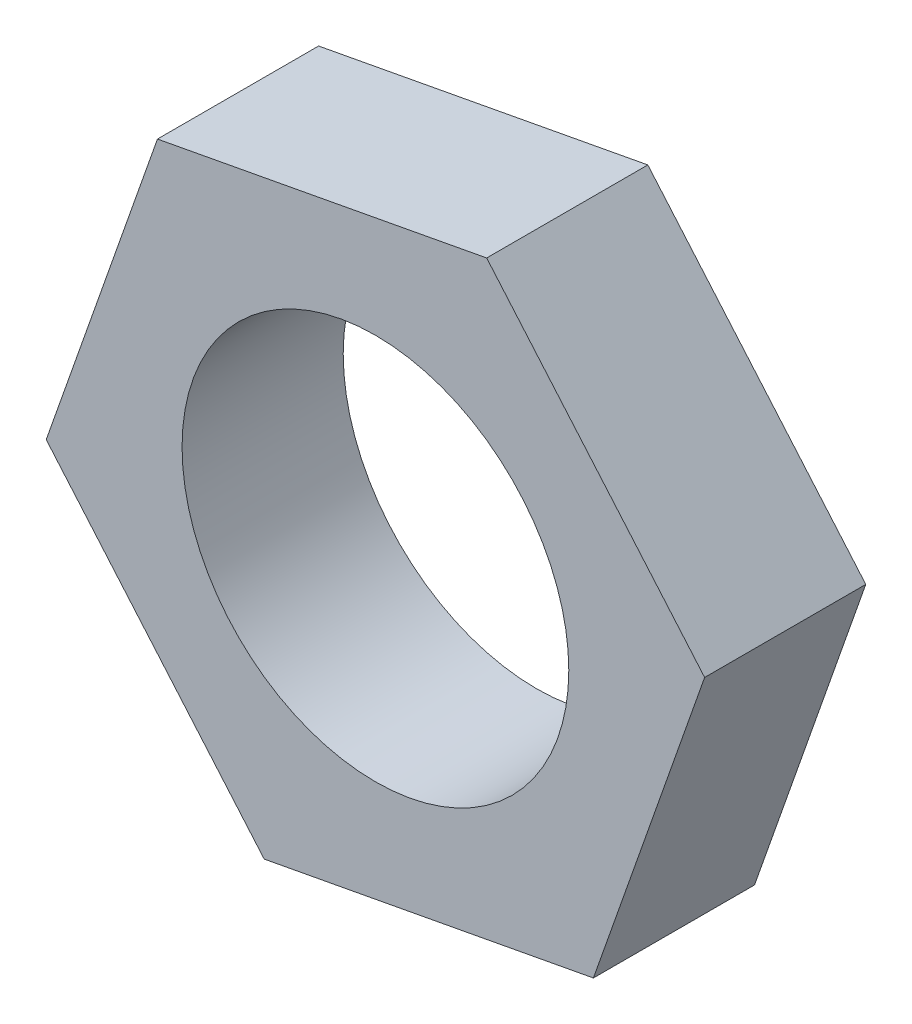
ISO-10303-21;
HEADER;
FILE_DESCRIPTION(('STEP AP214'),'2;1');
FILE_NAME('part.step','',(''),(''),'','','');
FILE_SCHEMA(('AUTOMOTIVE_DESIGN { 1 0 10303 214 1 1 1 1 }'));
ENDSEC;
DATA;
#1=APPLICATION_CONTEXT('core data for automotive mechanical design processes');
#2=APPLICATION_PROTOCOL_DEFINITION('international standard','automotive_design',2000,#1);
#3=PRODUCT_CONTEXT('',#1,'mechanical');
#4=PRODUCT('Part','Part','',(#3));
#5=PRODUCT_RELATED_PRODUCT_CATEGORY('part','',(#4));
#6=PRODUCT_DEFINITION_FORMATION('','',#4);
#7=PRODUCT_DEFINITION_CONTEXT('part definition',#1,'design');
#8=PRODUCT_DEFINITION('design','',#6,#7);
#9=PRODUCT_DEFINITION_SHAPE('','',#8);
#10=(LENGTH_UNIT() NAMED_UNIT(*) SI_UNIT(.MILLI.,.METRE.));
#11=(NAMED_UNIT(*) PLANE_ANGLE_UNIT() SI_UNIT($,.RADIAN.));
#12=(NAMED_UNIT(*) SI_UNIT($,.STERADIAN.) SOLID_ANGLE_UNIT());
#13=UNCERTAINTY_MEASURE_WITH_UNIT(LENGTH_MEASURE(1.E-05),#10,'distance_accuracy_value','');
#14=(GEOMETRIC_REPRESENTATION_CONTEXT(3) GLOBAL_UNCERTAINTY_ASSIGNED_CONTEXT((#13)) GLOBAL_UNIT_ASSIGNED_CONTEXT((#10,
#11,#12)) REPRESENTATION_CONTEXT('',''));
#15=CARTESIAN_POINT('',(0.,0.,0.));
#16=DIRECTION('',(0.,0.,1.));
#17=DIRECTION('',(1.,0.,0.));
#18=AXIS2_PLACEMENT_3D('',#15,#16,#17);
#19=CARTESIAN_POINT('',(0.,0.,2.5));
#20=DIRECTION('',(0.,0.,1.));
#21=DIRECTION('',(1.,0.,0.));
#22=AXIS2_PLACEMENT_3D('',#19,#20,#21);
#23=PLANE('',#22);
#24=DIRECTION('',(0.98293119236739,0.183973560793993,0.));
#25=VECTOR('',#24,1.);
#26=CARTESIAN_POINT('',(-3.45169824942779,-9.80233539494018,2.5));
#27=LINE('',#26,#25);
#28=CARTESIAN_POINT('',(-3.45169824942779,-9.80233539494018,2.5));
#29=VERTEX_POINT('',#28);
#30=CARTESIAN_POINT('',(6.76322234371967,-7.89042606767284,2.5));
#31=VERTEX_POINT('',#30);
#32=EDGE_CURVE('E146',#29,#31,#27,.T.);
#33=ORIENTED_EDGE('',*,*,#32,.T.);
#34=DIRECTION('',(0.332139818911416,0.943230163159285,0.));
#35=VECTOR('',#34,1.);
#36=CARTESIAN_POINT('',(6.76322234371967,-7.89042606767284,2.5));
#37=LINE('',#36,#35);
#38=CARTESIAN_POINT('',(10.2149205931475,1.91190932726735,2.5));
#39=VERTEX_POINT('',#38);
#40=EDGE_CURVE('E94',#31,#39,#37,.T.);
#41=ORIENTED_EDGE('',*,*,#40,.T.);
#42=DIRECTION('',(-0.650791373455974,0.759256602365292,0.));
#43=VECTOR('',#42,1.);
#44=CARTESIAN_POINT('',(10.2149205931475,1.91190932726735,2.5));
#45=LINE('',#44,#43);
#46=CARTESIAN_POINT('',(3.4516982494278,9.80233539494018,2.5));
#47=VERTEX_POINT('',#46);
#48=EDGE_CURVE('E107',#39,#47,#45,.T.);
#49=ORIENTED_EDGE('',*,*,#48,.T.);
#50=DIRECTION('',(-0.98293119236739,-0.183973560793993,0.));
#51=VECTOR('',#50,1.);
#52=CARTESIAN_POINT('',(3.4516982494278,9.80233539494018,2.5));
#53=LINE('',#52,#51);
#54=CARTESIAN_POINT('',(-6.76322234371966,7.89042606767284,2.5));
#55=VERTEX_POINT('',#54);
#56=EDGE_CURVE('E101',#47,#55,#53,.T.);
#57=ORIENTED_EDGE('',*,*,#56,.T.);
#58=DIRECTION('',(-0.332139818911417,-0.943230163159285,0.));
#59=VECTOR('',#58,1.);
#60=CARTESIAN_POINT('',(-6.76322234371966,7.89042606767284,2.5));
#61=LINE('',#60,#59);
#62=CARTESIAN_POINT('',(-10.2149205931475,-1.91190932726734,2.5));
#63=VERTEX_POINT('',#62);
#64=EDGE_CURVE('E105',#55,#63,#61,.T.);
#65=ORIENTED_EDGE('',*,*,#64,.T.);
#66=DIRECTION('',(0.650791373455974,-0.759256602365292,0.));
#67=VECTOR('',#66,1.);
#68=CARTESIAN_POINT('',(-10.2149205931475,-1.91190932726734,2.5));
#69=LINE('',#68,#67);
#70=EDGE_CURVE('E57',#63,#29,#69,.T.);
#71=ORIENTED_EDGE('',*,*,#70,.T.);
#72=EDGE_LOOP('',(#33,#41,#49,#57,#65,#71));
#73=FACE_BOUND('',#72,.T.);
#74=CARTESIAN_POINT('',(0.,0.,2.5));
#75=DIRECTION('',(0.,0.,1.));
#76=DIRECTION('',(1.,0.,0.));
#77=AXIS2_PLACEMENT_3D('',#74,#75,#76);
#78=CIRCLE('',#77,6.);
#79=CARTESIAN_POINT('',(6.,0.,2.5));
#80=VERTEX_POINT('',#79);
#81=EDGE_CURVE('E134',#80,#80,#78,.T.);
#82=ORIENTED_EDGE('',*,*,#81,.F.);
#83=EDGE_LOOP('',(#82));
#84=FACE_BOUND('',#83,.T.);
#85=ADVANCED_FACE('F39',(#73,#84),#23,.T.);
#86=CARTESIAN_POINT('',(0.,0.,-2.5));
#87=DIRECTION('',(0.,0.,1.));
#88=DIRECTION('',(1.,0.,0.));
#89=AXIS2_PLACEMENT_3D('',#86,#87,#88);
#90=PLANE('',#89);
#91=DIRECTION('',(0.98293119236739,0.183973560793993,0.));
#92=VECTOR('',#91,1.);
#93=CARTESIAN_POINT('',(-3.45169824942779,-9.80233539494018,-2.5));
#94=LINE('',#93,#92);
#95=CARTESIAN_POINT('',(-3.45169824942779,-9.80233539494018,-2.5));
#96=VERTEX_POINT('',#95);
#97=CARTESIAN_POINT('',(6.76322234371967,-7.89042606767284,-2.5));
#98=VERTEX_POINT('',#97);
#99=EDGE_CURVE('E129',#96,#98,#94,.T.);
#100=ORIENTED_EDGE('',*,*,#99,.F.);
#101=DIRECTION('',(0.650791373455974,-0.759256602365292,0.));
#102=VECTOR('',#101,1.);
#103=CARTESIAN_POINT('',(-10.2149205931475,-1.91190932726734,-2.5));
#104=LINE('',#103,#102);
#105=CARTESIAN_POINT('',(-10.2149205931475,-1.91190932726734,-2.5));
#106=VERTEX_POINT('',#105);
#107=EDGE_CURVE('E86',#106,#96,#104,.T.);
#108=ORIENTED_EDGE('',*,*,#107,.F.);
#109=DIRECTION('',(-0.332139818911417,-0.943230163159285,0.));
#110=VECTOR('',#109,1.);
#111=CARTESIAN_POINT('',(-6.76322234371966,7.89042606767284,-2.5));
#112=LINE('',#111,#110);
#113=CARTESIAN_POINT('',(-6.76322234371966,7.89042606767284,-2.5));
#114=VERTEX_POINT('',#113);
#115=EDGE_CURVE('E80',#114,#106,#112,.T.);
#116=ORIENTED_EDGE('',*,*,#115,.F.);
#117=DIRECTION('',(-0.98293119236739,-0.183973560793993,0.));
#118=VECTOR('',#117,1.);
#119=CARTESIAN_POINT('',(3.4516982494278,9.80233539494018,-2.5));
#120=LINE('',#119,#118);
#121=CARTESIAN_POINT('',(3.4516982494278,9.80233539494018,-2.5));
#122=VERTEX_POINT('',#121);
#123=EDGE_CURVE('E116',#122,#114,#120,.T.);
#124=ORIENTED_EDGE('',*,*,#123,.F.);
#125=DIRECTION('',(-0.650791373455974,0.759256602365292,0.));
#126=VECTOR('',#125,1.);
#127=CARTESIAN_POINT('',(10.2149205931475,1.91190932726735,-2.5));
#128=LINE('',#127,#126);
#129=CARTESIAN_POINT('',(10.2149205931475,1.91190932726735,-2.5));
#130=VERTEX_POINT('',#129);
#131=EDGE_CURVE('E137',#130,#122,#128,.T.);
#132=ORIENTED_EDGE('',*,*,#131,.F.);
#133=DIRECTION('',(0.332139818911416,0.943230163159285,0.));
#134=VECTOR('',#133,1.);
#135=CARTESIAN_POINT('',(6.76322234371967,-7.89042606767284,-2.5));
#136=LINE('',#135,#134);
#137=EDGE_CURVE('E133',#98,#130,#136,.T.);
#138=ORIENTED_EDGE('',*,*,#137,.F.);
#139=EDGE_LOOP('',(#100,#108,#116,#124,#132,#138));
#140=FACE_BOUND('',#139,.T.);
#141=CARTESIAN_POINT('',(0.,0.,-2.5));
#142=DIRECTION('',(0.,0.,1.));
#143=DIRECTION('',(1.,0.,0.));
#144=AXIS2_PLACEMENT_3D('',#141,#142,#143);
#145=CIRCLE('',#144,6.);
#146=CARTESIAN_POINT('',(6.,0.,-2.5));
#147=VERTEX_POINT('',#146);
#148=EDGE_CURVE('E243',#147,#147,#145,.T.);
#149=ORIENTED_EDGE('',*,*,#148,.T.);
#150=EDGE_LOOP('',(#149));
#151=FACE_BOUND('',#150,.T.);
#152=ADVANCED_FACE('F159',(#140,#151),#90,.F.);
#153=CARTESIAN_POINT('',(-3.45169824942779,-9.80233539494018,2.5));
#154=DIRECTION('',(-0.183973560793993,0.98293119236739,0.));
#155=DIRECTION('',(-0.98293119236739,-0.183973560793993,0.));
#156=AXIS2_PLACEMENT_3D('',#153,#154,#155);
#157=PLANE('',#156);
#158=ORIENTED_EDGE('',*,*,#99,.T.);
#159=DIRECTION('',(0.,0.,-1.));
#160=VECTOR('',#159,1.);
#161=CARTESIAN_POINT('',(6.76322234371967,-7.89042606767284,2.5));
#162=LINE('',#161,#160);
#163=EDGE_CURVE('E11',#31,#98,#162,.T.);
#164=ORIENTED_EDGE('',*,*,#163,.F.);
#165=ORIENTED_EDGE('',*,*,#32,.F.);
#166=DIRECTION('',(0.,0.,-1.));
#167=VECTOR('',#166,1.);
#168=CARTESIAN_POINT('',(-3.45169824942779,-9.80233539494018,2.5));
#169=LINE('',#168,#167);
#170=EDGE_CURVE('E125',#29,#96,#169,.T.);
#171=ORIENTED_EDGE('',*,*,#170,.T.);
#172=EDGE_LOOP('',(#158,#164,#165,#171));
#173=FACE_BOUND('',#172,.T.);
#174=ADVANCED_FACE('F41',(#173),#157,.F.);
#175=CARTESIAN_POINT('',(6.76322234371967,-7.89042606767284,2.5));
#176=DIRECTION('',(-0.943230163159285,0.332139818911416,0.));
#177=DIRECTION('',(-0.332139818911416,-0.943230163159285,0.));
#178=AXIS2_PLACEMENT_3D('',#175,#176,#177);
#179=PLANE('',#178);
#180=ORIENTED_EDGE('',*,*,#137,.T.);
#181=DIRECTION('',(0.,0.,-1.));
#182=VECTOR('',#181,1.);
#183=CARTESIAN_POINT('',(10.2149205931475,1.91190932726735,2.5));
#184=LINE('',#183,#182);
#185=EDGE_CURVE('E49',#39,#130,#184,.T.);
#186=ORIENTED_EDGE('',*,*,#185,.F.);
#187=ORIENTED_EDGE('',*,*,#40,.F.);
#188=ORIENTED_EDGE('',*,*,#163,.T.);
#189=EDGE_LOOP('',(#180,#186,#187,#188));
#190=FACE_BOUND('',#189,.T.);
#191=ADVANCED_FACE('F184',(#190),#179,.F.);
#192=CARTESIAN_POINT('',(10.2149205931475,1.91190932726735,2.5));
#193=DIRECTION('',(-0.759256602365292,-0.650791373455974,0.));
#194=DIRECTION('',(0.650791373455974,-0.759256602365292,0.));
#195=AXIS2_PLACEMENT_3D('',#192,#193,#194);
#196=PLANE('',#195);
#197=ORIENTED_EDGE('',*,*,#131,.T.);
#198=DIRECTION('',(0.,0.,-1.));
#199=VECTOR('',#198,1.);
#200=CARTESIAN_POINT('',(3.4516982494278,9.80233539494018,2.5));
#201=LINE('',#200,#199);
#202=EDGE_CURVE('E118',#47,#122,#201,.T.);
#203=ORIENTED_EDGE('',*,*,#202,.F.);
#204=ORIENTED_EDGE('',*,*,#48,.F.);
#205=ORIENTED_EDGE('',*,*,#185,.T.);
#206=EDGE_LOOP('',(#197,#203,#204,#205));
#207=FACE_BOUND('',#206,.T.);
#208=ADVANCED_FACE('F156',(#207),#196,.F.);
#209=CARTESIAN_POINT('',(3.4516982494278,9.80233539494018,2.5));
#210=DIRECTION('',(0.183973560793993,-0.98293119236739,0.));
#211=DIRECTION('',(0.98293119236739,0.183973560793993,0.));
#212=AXIS2_PLACEMENT_3D('',#209,#210,#211);
#213=PLANE('',#212);
#214=ORIENTED_EDGE('',*,*,#123,.T.);
#215=DIRECTION('',(0.,0.,-1.));
#216=VECTOR('',#215,1.);
#217=CARTESIAN_POINT('',(-6.76322234371966,7.89042606767284,2.5));
#218=LINE('',#217,#216);
#219=EDGE_CURVE('E113',#55,#114,#218,.T.);
#220=ORIENTED_EDGE('',*,*,#219,.F.);
#221=ORIENTED_EDGE('',*,*,#56,.F.);
#222=ORIENTED_EDGE('',*,*,#202,.T.);
#223=EDGE_LOOP('',(#214,#220,#221,#222));
#224=FACE_BOUND('',#223,.T.);
#225=ADVANCED_FACE('F114',(#224),#213,.F.);
#226=CARTESIAN_POINT('',(-6.76322234371966,7.89042606767284,2.5));
#227=DIRECTION('',(0.943230163159285,-0.332139818911417,0.));
#228=DIRECTION('',(0.332139818911417,0.943230163159285,0.));
#229=AXIS2_PLACEMENT_3D('',#226,#227,#228);
#230=PLANE('',#229);
#231=ORIENTED_EDGE('',*,*,#115,.T.);
#232=DIRECTION('',(0.,0.,-1.));
#233=VECTOR('',#232,1.);
#234=CARTESIAN_POINT('',(-10.2149205931475,-1.91190932726734,2.5));
#235=LINE('',#234,#233);
#236=EDGE_CURVE('E119',#63,#106,#235,.T.);
#237=ORIENTED_EDGE('',*,*,#236,.F.);
#238=ORIENTED_EDGE('',*,*,#64,.F.);
#239=ORIENTED_EDGE('',*,*,#219,.T.);
#240=EDGE_LOOP('',(#231,#237,#238,#239));
#241=FACE_BOUND('',#240,.T.);
#242=ADVANCED_FACE('F121',(#241),#230,.F.);
#243=CARTESIAN_POINT('',(-10.2149205931475,-1.91190932726734,2.5));
#244=DIRECTION('',(0.759256602365292,0.650791373455974,0.));
#245=DIRECTION('',(-0.650791373455974,0.759256602365292,0.));
#246=AXIS2_PLACEMENT_3D('',#243,#244,#245);
#247=PLANE('',#246);
#248=ORIENTED_EDGE('',*,*,#107,.T.);
#249=ORIENTED_EDGE('',*,*,#170,.F.);
#250=ORIENTED_EDGE('',*,*,#70,.F.);
#251=ORIENTED_EDGE('',*,*,#236,.T.);
#252=EDGE_LOOP('',(#248,#249,#250,#251));
#253=FACE_BOUND('',#252,.T.);
#254=ADVANCED_FACE('F164',(#253),#247,.F.);
#255=CARTESIAN_POINT('',(0.,0.,2.5));
#256=DIRECTION('',(0.,0.,-1.));
#257=DIRECTION('',(-1.,0.,0.));
#258=AXIS2_PLACEMENT_3D('',#255,#256,#257);
#259=CYLINDRICAL_SURFACE('',#258,6.);
#260=ORIENTED_EDGE('',*,*,#81,.T.);
#261=EDGE_LOOP('',(#260));
#262=FACE_BOUND('',#261,.T.);
#263=ORIENTED_EDGE('',*,*,#148,.F.);
#264=EDGE_LOOP('',(#263));
#265=FACE_BOUND('',#264,.T.);
#266=ADVANCED_FACE('F166',(#262,#265),#259,.F.);
#267=CLOSED_SHELL('',(#85,#152,#174,#191,#208,#225,#242,#254,#266));
#268=MANIFOLD_SOLID_BREP('B2',#267);
#269=ADVANCED_BREP_SHAPE_REPRESENTATION('',(#18,#268),#14);
#270=SHAPE_DEFINITION_REPRESENTATION(#9,#269);
ENDSEC;
END-ISO-10303-21;
